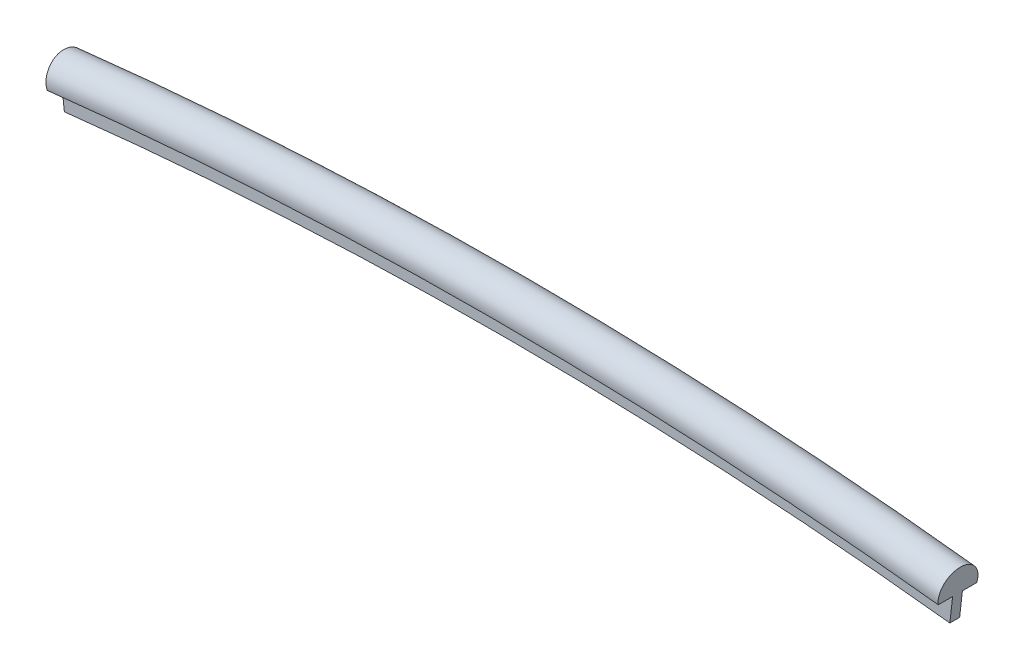
ISO-10303-21;
HEADER;
FILE_DESCRIPTION(('STEP AP214'),'2;1');
FILE_NAME('part.step','',(''),(''),'','','');
FILE_SCHEMA(('AUTOMOTIVE_DESIGN { 1 0 10303 214 1 1 1 1 }'));
ENDSEC;
DATA;
#1=APPLICATION_CONTEXT('core data for automotive mechanical design processes');
#2=APPLICATION_PROTOCOL_DEFINITION('international standard','automotive_design',2000,#1);
#3=PRODUCT_CONTEXT('',#1,'mechanical');
#4=PRODUCT('Part','Part','',(#3));
#5=PRODUCT_RELATED_PRODUCT_CATEGORY('part','',(#4));
#6=PRODUCT_DEFINITION_FORMATION('','',#4);
#7=PRODUCT_DEFINITION_CONTEXT('part definition',#1,'design');
#8=PRODUCT_DEFINITION('design','',#6,#7);
#9=PRODUCT_DEFINITION_SHAPE('','',#8);
#10=(LENGTH_UNIT() NAMED_UNIT(*) SI_UNIT(.MILLI.,.METRE.));
#11=(NAMED_UNIT(*) PLANE_ANGLE_UNIT() SI_UNIT($,.RADIAN.));
#12=(NAMED_UNIT(*) SI_UNIT($,.STERADIAN.) SOLID_ANGLE_UNIT());
#13=UNCERTAINTY_MEASURE_WITH_UNIT(LENGTH_MEASURE(1.E-05),#10,'distance_accuracy_value','');
#14=(GEOMETRIC_REPRESENTATION_CONTEXT(3) GLOBAL_UNCERTAINTY_ASSIGNED_CONTEXT((#13)) GLOBAL_UNIT_ASSIGNED_CONTEXT((#10,
#11,#12)) REPRESENTATION_CONTEXT('',''));
#15=CARTESIAN_POINT('',(0.,0.,0.));
#16=DIRECTION('',(0.,0.,1.));
#17=DIRECTION('',(1.,0.,0.));
#18=AXIS2_PLACEMENT_3D('',#15,#16,#17);
#19=CARTESIAN_POINT('',(0.,0.,70.5976415970385));
#20=DIRECTION('',(0.,0.,1.));
#21=DIRECTION('',(1.,0.,0.));
#22=AXIS2_PLACEMENT_3D('',#19,#20,#21);
#23=CYLINDRICAL_SURFACE('',#22,241.3);
#24=CARTESIAN_POINT('',(0.,0.,1.18));
#25=DIRECTION('',(0.,0.,1.));
#26=DIRECTION('',(1.,0.,0.));
#27=AXIS2_PLACEMENT_3D('',#24,#25,#26);
#28=CIRCLE('',#27,241.3);
#29=CARTESIAN_POINT('',(27.266660126452,239.754497863019,1.18));
#30=VERTEX_POINT('',#29);
#31=CARTESIAN_POINT('',(-27.266660126452,239.754497863019,1.18));
#32=VERTEX_POINT('',#31);
#33=EDGE_CURVE('E11',#30,#32,#28,.T.);
#34=ORIENTED_EDGE('',*,*,#33,.T.);
#35=DIRECTION('',(0.,0.,-1.));
#36=VECTOR('',#35,1.);
#37=CARTESIAN_POINT('',(-27.266660126452,239.754497863019,1.18));
#38=LINE('',#37,#36);
#39=CARTESIAN_POINT('',(-27.266660126452,239.754497863019,0.3));
#40=VERTEX_POINT('',#39);
#41=EDGE_CURVE('E103',#32,#40,#38,.T.);
#42=ORIENTED_EDGE('',*,*,#41,.T.);
#43=CARTESIAN_POINT('',(0.,0.,0.299999999999995));
#44=DIRECTION('',(0.,0.,1.));
#45=DIRECTION('',(1.,0.,0.));
#46=AXIS2_PLACEMENT_3D('',#43,#44,#45);
#47=CIRCLE('',#46,241.3);
#48=CARTESIAN_POINT('',(27.266660126452,239.754497863019,0.3));
#49=VERTEX_POINT('',#48);
#50=EDGE_CURVE('E85',#49,#40,#47,.T.);
#51=ORIENTED_EDGE('',*,*,#50,.F.);
#52=DIRECTION('',(0.,0.,-1.));
#53=VECTOR('',#52,1.);
#54=CARTESIAN_POINT('',(27.266660126452,239.754497863019,1.18));
#55=LINE('',#54,#53);
#56=EDGE_CURVE('E117',#30,#49,#55,.T.);
#57=ORIENTED_EDGE('',*,*,#56,.F.);
#58=EDGE_LOOP('',(#34,#42,#51,#57));
#59=FACE_BOUND('',#58,.T.);
#60=ADVANCED_FACE('F33',(#59),#23,.F.);
#61=CARTESIAN_POINT('',(0.,0.,0.));
#62=DIRECTION('',(0.,0.,1.));
#63=DIRECTION('',(1.,0.,0.));
#64=AXIS2_PLACEMENT_3D('',#61,#62,#63);
#65=TOROIDAL_SURFACE('',#64,241.586013989906,1.21416802890791);
#66=CARTESIAN_POINT('',(0.,0.,-1.18));
#67=DIRECTION('',(0.,0.,1.));
#68=DIRECTION('',(1.,0.,0.));
#69=AXIS2_PLACEMENT_3D('',#66,#67,#68);
#70=CIRCLE('',#69,241.3);
#71=CARTESIAN_POINT('',(27.266660126452,239.754497863019,-1.18));
#72=VERTEX_POINT('',#71);
#73=CARTESIAN_POINT('',(-27.266660126452,239.754497863019,-1.18));
#74=VERTEX_POINT('',#73);
#75=EDGE_CURVE('E41',#72,#74,#70,.T.);
#76=ORIENTED_EDGE('',*,*,#75,.T.);
#77=CARTESIAN_POINT('',(-27.2989794229882,240.038679962198,0.));
#78=DIRECTION('',(0.993595100965683,0.112999005911529,0.));
#79=DIRECTION('',(0.,0.,1.));
#80=AXIS2_PLACEMENT_3D('',#77,#78,#79);
#81=CIRCLE('',#80,1.21416802890791);
#82=EDGE_CURVE('E115',#74,#32,#81,.T.);
#83=ORIENTED_EDGE('',*,*,#82,.T.);
#84=ORIENTED_EDGE('',*,*,#33,.F.);
#85=CARTESIAN_POINT('',(27.2989794229882,240.038679962198,0.));
#86=DIRECTION('',(0.993595100965683,-0.112999005911529,0.));
#87=DIRECTION('',(0.,0.,1.));
#88=AXIS2_PLACEMENT_3D('',#85,#86,#87);
#89=CIRCLE('',#88,1.21416802890791);
#90=EDGE_CURVE('E97',#72,#30,#89,.T.);
#91=ORIENTED_EDGE('',*,*,#90,.F.);
#92=EDGE_LOOP('',(#76,#83,#84,#91));
#93=FACE_BOUND('',#92,.T.);
#94=ADVANCED_FACE('F35',(#93),#65,.T.);
#95=CARTESIAN_POINT('',(0.,0.,70.5976415970385));
#96=DIRECTION('',(0.,0.,1.));
#97=DIRECTION('',(1.,0.,0.));
#98=AXIS2_PLACEMENT_3D('',#95,#96,#97);
#99=CYLINDRICAL_SURFACE('',#98,241.3);
#100=CARTESIAN_POINT('',(0.,0.,-0.299999999999995));
#101=DIRECTION('',(0.,0.,1.));
#102=DIRECTION('',(1.,0.,0.));
#103=AXIS2_PLACEMENT_3D('',#100,#101,#102);
#104=CIRCLE('',#103,241.3);
#105=CARTESIAN_POINT('',(27.266660126452,239.754497863019,-0.3));
#106=VERTEX_POINT('',#105);
#107=CARTESIAN_POINT('',(-27.266660126452,239.754497863019,-0.3));
#108=VERTEX_POINT('',#107);
#109=EDGE_CURVE('E132',#106,#108,#104,.T.);
#110=ORIENTED_EDGE('',*,*,#109,.T.);
#111=DIRECTION('',(0.,0.,-1.));
#112=VECTOR('',#111,1.);
#113=CARTESIAN_POINT('',(-27.266660126452,239.754497863019,-0.3));
#114=LINE('',#113,#112);
#115=EDGE_CURVE('E113',#108,#74,#114,.T.);
#116=ORIENTED_EDGE('',*,*,#115,.T.);
#117=ORIENTED_EDGE('',*,*,#75,.F.);
#118=DIRECTION('',(0.,0.,-1.));
#119=VECTOR('',#118,1.);
#120=CARTESIAN_POINT('',(27.266660126452,239.754497863019,-0.3));
#121=LINE('',#120,#119);
#122=EDGE_CURVE('E125',#106,#72,#121,.T.);
#123=ORIENTED_EDGE('',*,*,#122,.F.);
#124=EDGE_LOOP('',(#110,#116,#117,#123));
#125=FACE_BOUND('',#124,.T.);
#126=ADVANCED_FACE('F134',(#125),#99,.F.);
#127=CARTESIAN_POINT('',(27.0971616175847,238.264105211571,-0.3));
#128=DIRECTION('',(0.,0.,1.));
#129=DIRECTION('',(1.,0.,0.));
#130=AXIS2_PLACEMENT_3D('',#127,#128,#129);
#131=PLANE('',#130);
#132=CARTESIAN_POINT('',(0.,0.,-0.299999999999995));
#133=DIRECTION('',(0.,0.,1.));
#134=DIRECTION('',(1.,0.,0.));
#135=AXIS2_PLACEMENT_3D('',#132,#133,#134);
#136=CIRCLE('',#135,239.8);
#137=CARTESIAN_POINT('',(27.0971616175847,238.264105211571,-0.3));
#138=VERTEX_POINT('',#137);
#139=CARTESIAN_POINT('',(-27.0971616175847,238.264105211571,-0.3));
#140=VERTEX_POINT('',#139);
#141=EDGE_CURVE('E129',#138,#140,#136,.T.);
#142=ORIENTED_EDGE('',*,*,#141,.T.);
#143=DIRECTION('',(-0.112999005911529,0.993595100965683,0.));
#144=VECTOR('',#143,1.);
#145=CARTESIAN_POINT('',(-27.0971616175847,238.264105211571,-0.3));
#146=LINE('',#145,#144);
#147=EDGE_CURVE('E110',#140,#108,#146,.T.);
#148=ORIENTED_EDGE('',*,*,#147,.T.);
#149=ORIENTED_EDGE('',*,*,#109,.F.);
#150=DIRECTION('',(0.112999005911529,0.993595100965683,0.));
#151=VECTOR('',#150,1.);
#152=CARTESIAN_POINT('',(27.0971616175847,238.264105211571,-0.3));
#153=LINE('',#152,#151);
#154=EDGE_CURVE('E122',#138,#106,#153,.T.);
#155=ORIENTED_EDGE('',*,*,#154,.F.);
#156=EDGE_LOOP('',(#142,#148,#149,#155));
#157=FACE_BOUND('',#156,.T.);
#158=ADVANCED_FACE('F136',(#157),#131,.F.);
#159=CARTESIAN_POINT('',(0.,0.,70.5976415970385));
#160=DIRECTION('',(0.,0.,1.));
#161=DIRECTION('',(1.,0.,0.));
#162=AXIS2_PLACEMENT_3D('',#159,#160,#161);
#163=CYLINDRICAL_SURFACE('',#162,239.8);
#164=CARTESIAN_POINT('',(0.,0.,0.299999999999995));
#165=DIRECTION('',(0.,0.,1.));
#166=DIRECTION('',(1.,0.,0.));
#167=AXIS2_PLACEMENT_3D('',#164,#165,#166);
#168=CIRCLE('',#167,239.8);
#169=CARTESIAN_POINT('',(27.0971616175847,238.264105211571,0.3));
#170=VERTEX_POINT('',#169);
#171=CARTESIAN_POINT('',(-27.0971616175847,238.264105211571,0.3));
#172=VERTEX_POINT('',#171);
#173=EDGE_CURVE('E96',#170,#172,#168,.T.);
#174=ORIENTED_EDGE('',*,*,#173,.T.);
#175=DIRECTION('',(0.,0.,-1.));
#176=VECTOR('',#175,1.);
#177=CARTESIAN_POINT('',(-27.0971616175847,238.264105211571,0.));
#178=LINE('',#177,#176);
#179=EDGE_CURVE('E105',#172,#140,#178,.T.);
#180=ORIENTED_EDGE('',*,*,#179,.T.);
#181=ORIENTED_EDGE('',*,*,#141,.F.);
#182=DIRECTION('',(0.,0.,-1.));
#183=VECTOR('',#182,1.);
#184=CARTESIAN_POINT('',(27.0971616175847,238.264105211571,0.));
#185=LINE('',#184,#183);
#186=EDGE_CURVE('E120',#170,#138,#185,.T.);
#187=ORIENTED_EDGE('',*,*,#186,.F.);
#188=EDGE_LOOP('',(#174,#180,#181,#187));
#189=FACE_BOUND('',#188,.T.);
#190=ADVANCED_FACE('F141',(#189),#163,.F.);
#191=CARTESIAN_POINT('',(27.0971616175847,238.264105211571,0.3));
#192=DIRECTION('',(0.,0.,-1.));
#193=DIRECTION('',(-1.,0.,0.));
#194=AXIS2_PLACEMENT_3D('',#191,#192,#193);
#195=PLANE('',#194);
#196=DIRECTION('',(-0.112999005911529,-0.993595100965683,0.));
#197=VECTOR('',#196,1.);
#198=CARTESIAN_POINT('',(27.0971616175847,238.264105211571,0.3));
#199=LINE('',#198,#197);
#200=EDGE_CURVE('E91',#49,#170,#199,.T.);
#201=ORIENTED_EDGE('',*,*,#200,.F.);
#202=ORIENTED_EDGE('',*,*,#50,.T.);
#203=DIRECTION('',(0.112999005911529,-0.993595100965683,0.));
#204=VECTOR('',#203,1.);
#205=CARTESIAN_POINT('',(-27.0971616175847,238.264105211571,0.3));
#206=LINE('',#205,#204);
#207=EDGE_CURVE('E88',#40,#172,#206,.T.);
#208=ORIENTED_EDGE('',*,*,#207,.T.);
#209=ORIENTED_EDGE('',*,*,#173,.F.);
#210=EDGE_LOOP('',(#201,#202,#208,#209));
#211=FACE_BOUND('',#210,.T.);
#212=ADVANCED_FACE('F87',(#211),#195,.F.);
#213=CARTESIAN_POINT('',(27.2989794229882,240.038679962198,0.));
#214=DIRECTION('',(-0.993595100965683,0.112999005911529,0.));
#215=DIRECTION('',(0.,0.,1.));
#216=AXIS2_PLACEMENT_3D('',#213,#214,#215);
#217=PLANE('',#216);
#218=ORIENTED_EDGE('',*,*,#56,.T.);
#219=ORIENTED_EDGE('',*,*,#200,.T.);
#220=ORIENTED_EDGE('',*,*,#186,.T.);
#221=ORIENTED_EDGE('',*,*,#154,.T.);
#222=ORIENTED_EDGE('',*,*,#122,.T.);
#223=ORIENTED_EDGE('',*,*,#90,.T.);
#224=EDGE_LOOP('',(#218,#219,#220,#221,#222,#223));
#225=FACE_BOUND('',#224,.T.);
#226=ADVANCED_FACE('F143',(#225),#217,.F.);
#227=CARTESIAN_POINT('',(-27.2989794229882,240.038679962198,0.));
#228=DIRECTION('',(-0.993595100965683,-0.112999005911529,0.));
#229=DIRECTION('',(0.,0.,1.));
#230=AXIS2_PLACEMENT_3D('',#227,#228,#229);
#231=PLANE('',#230);
#232=ORIENTED_EDGE('',*,*,#41,.F.);
#233=ORIENTED_EDGE('',*,*,#82,.F.);
#234=ORIENTED_EDGE('',*,*,#115,.F.);
#235=ORIENTED_EDGE('',*,*,#147,.F.);
#236=ORIENTED_EDGE('',*,*,#179,.F.);
#237=ORIENTED_EDGE('',*,*,#207,.F.);
#238=EDGE_LOOP('',(#232,#233,#234,#235,#236,#237));
#239=FACE_BOUND('',#238,.T.);
#240=ADVANCED_FACE('F101',(#239),#231,.T.);
#241=CLOSED_SHELL('',(#60,#94,#126,#158,#190,#212,#226,#240));
#242=MANIFOLD_SOLID_BREP('B2',#241);
#243=ADVANCED_BREP_SHAPE_REPRESENTATION('',(#18,#242),#14);
#244=SHAPE_DEFINITION_REPRESENTATION(#9,#243);
ENDSEC;
END-ISO-10303-21;
